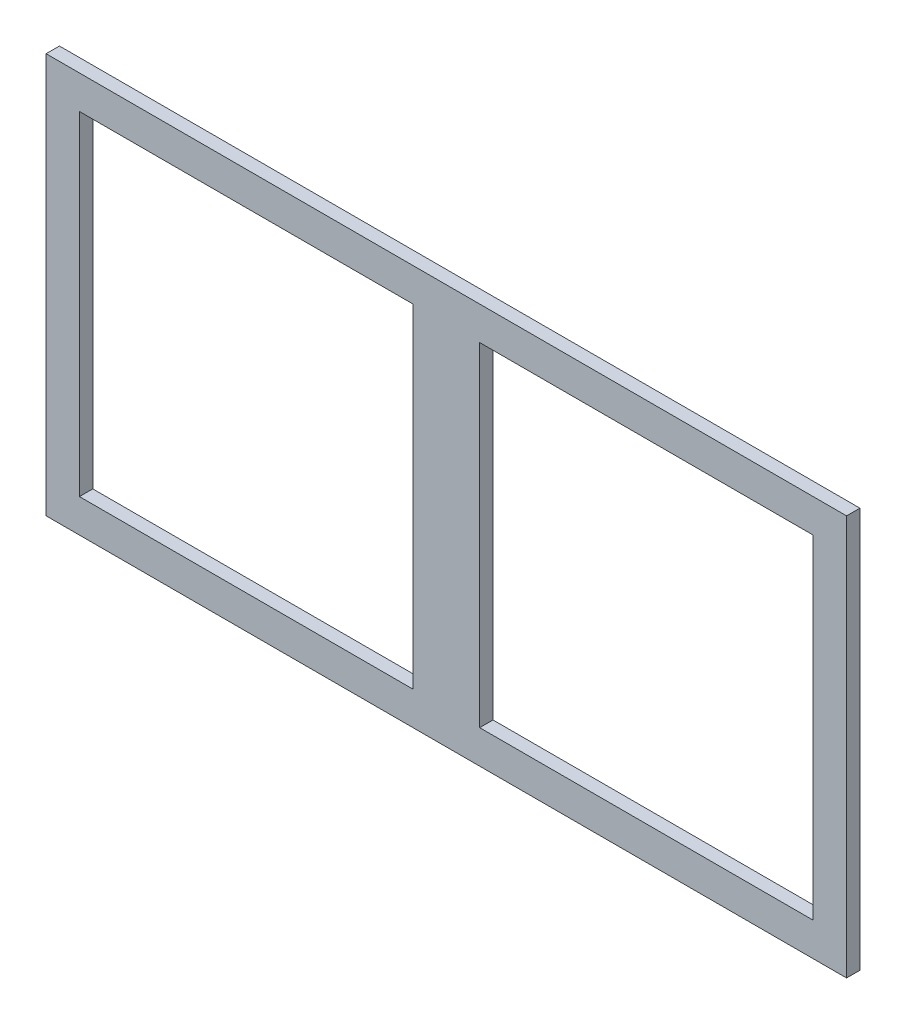
ISO-10303-21;
HEADER;
FILE_DESCRIPTION(('STEP AP214'),'2;1');
FILE_NAME('part.step','',(''),(''),'','','');
FILE_SCHEMA(('AUTOMOTIVE_DESIGN { 1 0 10303 214 1 1 1 1 }'));
ENDSEC;
DATA;
#1=APPLICATION_CONTEXT('core data for automotive mechanical design processes');
#2=APPLICATION_PROTOCOL_DEFINITION('international standard','automotive_design',2000,#1);
#3=PRODUCT_CONTEXT('',#1,'mechanical');
#4=PRODUCT('Part','Part','',(#3));
#5=PRODUCT_RELATED_PRODUCT_CATEGORY('part','',(#4));
#6=PRODUCT_DEFINITION_FORMATION('','',#4);
#7=PRODUCT_DEFINITION_CONTEXT('part definition',#1,'design');
#8=PRODUCT_DEFINITION('design','',#6,#7);
#9=PRODUCT_DEFINITION_SHAPE('','',#8);
#10=(LENGTH_UNIT() NAMED_UNIT(*) SI_UNIT(.MILLI.,.METRE.));
#11=(NAMED_UNIT(*) PLANE_ANGLE_UNIT() SI_UNIT($,.RADIAN.));
#12=(NAMED_UNIT(*) SI_UNIT($,.STERADIAN.) SOLID_ANGLE_UNIT());
#13=UNCERTAINTY_MEASURE_WITH_UNIT(LENGTH_MEASURE(1.E-05),#10,'distance_accuracy_value','');
#14=(GEOMETRIC_REPRESENTATION_CONTEXT(3) GLOBAL_UNCERTAINTY_ASSIGNED_CONTEXT((#13)) GLOBAL_UNIT_ASSIGNED_CONTEXT((#10,
#11,#12)) REPRESENTATION_CONTEXT('',''));
#15=CARTESIAN_POINT('',(0.,0.,0.));
#16=DIRECTION('',(0.,0.,1.));
#17=DIRECTION('',(1.,0.,0.));
#18=AXIS2_PLACEMENT_3D('',#15,#16,#17);
#19=CARTESIAN_POINT('',(-150.,0.,5.));
#20=DIRECTION('',(1.,0.,0.));
#21=DIRECTION('',(0.,0.,-1.));
#22=AXIS2_PLACEMENT_3D('',#19,#20,#21);
#23=PLANE('',#22);
#24=DIRECTION('',(0.,-1.,0.));
#25=VECTOR('',#24,1.);
#26=CARTESIAN_POINT('',(-150.,0.,0.));
#27=LINE('',#26,#25);
#28=CARTESIAN_POINT('',(-150.,150.,0.));
#29=VERTEX_POINT('',#28);
#30=CARTESIAN_POINT('',(-150.,0.,0.));
#31=VERTEX_POINT('',#30);
#32=EDGE_CURVE('E158',#29,#31,#27,.T.);
#33=ORIENTED_EDGE('',*,*,#32,.T.);
#34=DIRECTION('',(0.,0.,-1.));
#35=VECTOR('',#34,1.);
#36=CARTESIAN_POINT('',(-150.,0.,5.));
#37=LINE('',#36,#35);
#38=CARTESIAN_POINT('',(-150.,0.,5.));
#39=VERTEX_POINT('',#38);
#40=EDGE_CURVE('E11',#39,#31,#37,.T.);
#41=ORIENTED_EDGE('',*,*,#40,.F.);
#42=DIRECTION('',(0.,-1.,0.));
#43=VECTOR('',#42,1.);
#44=CARTESIAN_POINT('',(-150.,0.,5.));
#45=LINE('',#44,#43);
#46=CARTESIAN_POINT('',(-150.,150.,5.));
#47=VERTEX_POINT('',#46);
#48=EDGE_CURVE('E191',#47,#39,#45,.T.);
#49=ORIENTED_EDGE('',*,*,#48,.F.);
#50=DIRECTION('',(0.,0.,-1.));
#51=VECTOR('',#50,1.);
#52=CARTESIAN_POINT('',(-150.,150.,5.));
#53=LINE('',#52,#51);
#54=EDGE_CURVE('E201',#47,#29,#53,.T.);
#55=ORIENTED_EDGE('',*,*,#54,.T.);
#56=EDGE_LOOP('',(#33,#41,#49,#55));
#57=FACE_BOUND('',#56,.T.);
#58=ADVANCED_FACE('F33',(#57),#23,.F.);
#59=CARTESIAN_POINT('',(150.,0.,5.));
#60=DIRECTION('',(0.,1.,0.));
#61=DIRECTION('',(0.,0.,1.));
#62=AXIS2_PLACEMENT_3D('',#59,#60,#61);
#63=PLANE('',#62);
#64=DIRECTION('',(1.,0.,0.));
#65=VECTOR('',#64,1.);
#66=CARTESIAN_POINT('',(150.,0.,0.));
#67=LINE('',#66,#65);
#68=CARTESIAN_POINT('',(150.,0.,0.));
#69=VERTEX_POINT('',#68);
#70=EDGE_CURVE('E204',#31,#69,#67,.T.);
#71=ORIENTED_EDGE('',*,*,#70,.T.);
#72=DIRECTION('',(0.,0.,-1.));
#73=VECTOR('',#72,1.);
#74=CARTESIAN_POINT('',(150.,0.,5.));
#75=LINE('',#74,#73);
#76=CARTESIAN_POINT('',(150.,0.,5.));
#77=VERTEX_POINT('',#76);
#78=EDGE_CURVE('E40',#77,#69,#75,.T.);
#79=ORIENTED_EDGE('',*,*,#78,.F.);
#80=DIRECTION('',(1.,0.,0.));
#81=VECTOR('',#80,1.);
#82=CARTESIAN_POINT('',(150.,0.,5.));
#83=LINE('',#82,#81);
#84=EDGE_CURVE('E194',#39,#77,#83,.T.);
#85=ORIENTED_EDGE('',*,*,#84,.F.);
#86=ORIENTED_EDGE('',*,*,#40,.T.);
#87=EDGE_LOOP('',(#71,#79,#85,#86));
#88=FACE_BOUND('',#87,.T.);
#89=ADVANCED_FACE('F233',(#88),#63,.F.);
#90=CARTESIAN_POINT('',(150.,0.,5.));
#91=DIRECTION('',(-1.,0.,0.));
#92=DIRECTION('',(0.,0.,1.));
#93=AXIS2_PLACEMENT_3D('',#90,#91,#92);
#94=PLANE('',#93);
#95=DIRECTION('',(0.,1.,0.));
#96=VECTOR('',#95,1.);
#97=CARTESIAN_POINT('',(150.,0.,0.));
#98=LINE('',#97,#96);
#99=CARTESIAN_POINT('',(150.,150.,0.));
#100=VERTEX_POINT('',#99);
#101=EDGE_CURVE('E206',#69,#100,#98,.T.);
#102=ORIENTED_EDGE('',*,*,#101,.T.);
#103=DIRECTION('',(0.,0.,-1.));
#104=VECTOR('',#103,1.);
#105=CARTESIAN_POINT('',(150.,150.,5.));
#106=LINE('',#105,#104);
#107=CARTESIAN_POINT('',(150.,150.,5.));
#108=VERTEX_POINT('',#107);
#109=EDGE_CURVE('E211',#108,#100,#106,.T.);
#110=ORIENTED_EDGE('',*,*,#109,.F.);
#111=DIRECTION('',(0.,1.,0.));
#112=VECTOR('',#111,1.);
#113=CARTESIAN_POINT('',(150.,0.,5.));
#114=LINE('',#113,#112);
#115=EDGE_CURVE('E197',#77,#108,#114,.T.);
#116=ORIENTED_EDGE('',*,*,#115,.F.);
#117=ORIENTED_EDGE('',*,*,#78,.T.);
#118=EDGE_LOOP('',(#102,#110,#116,#117));
#119=FACE_BOUND('',#118,.T.);
#120=ADVANCED_FACE('F218',(#119),#94,.F.);
#121=CARTESIAN_POINT('',(-150.,150.,5.));
#122=DIRECTION('',(0.,-1.,0.));
#123=DIRECTION('',(0.,0.,-1.));
#124=AXIS2_PLACEMENT_3D('',#121,#122,#123);
#125=PLANE('',#124);
#126=DIRECTION('',(-1.,0.,0.));
#127=VECTOR('',#126,1.);
#128=CARTESIAN_POINT('',(-150.,150.,0.));
#129=LINE('',#128,#127);
#130=EDGE_CURVE('E195',#100,#29,#129,.T.);
#131=ORIENTED_EDGE('',*,*,#130,.T.);
#132=ORIENTED_EDGE('',*,*,#54,.F.);
#133=DIRECTION('',(-1.,0.,0.));
#134=VECTOR('',#133,1.);
#135=CARTESIAN_POINT('',(-150.,150.,5.));
#136=LINE('',#135,#134);
#137=EDGE_CURVE('E199',#108,#47,#136,.T.);
#138=ORIENTED_EDGE('',*,*,#137,.F.);
#139=ORIENTED_EDGE('',*,*,#109,.T.);
#140=EDGE_LOOP('',(#131,#132,#138,#139));
#141=FACE_BOUND('',#140,.T.);
#142=ADVANCED_FACE('F226',(#141),#125,.F.);
#143=CARTESIAN_POINT('',(0.,0.,5.));
#144=DIRECTION('',(0.,0.,-1.));
#145=DIRECTION('',(-1.,0.,0.));
#146=AXIS2_PLACEMENT_3D('',#143,#144,#145);
#147=PLANE('',#146);
#148=DIRECTION('',(1.,0.,0.));
#149=VECTOR('',#148,1.);
#150=CARTESIAN_POINT('',(-137.5,12.5,5.));
#151=LINE('',#150,#149);
#152=CARTESIAN_POINT('',(-137.5,12.5,5.));
#153=VERTEX_POINT('',#152);
#154=CARTESIAN_POINT('',(-12.5,12.5,5.));
#155=VERTEX_POINT('',#154);
#156=EDGE_CURVE('E151',#153,#155,#151,.T.);
#157=ORIENTED_EDGE('',*,*,#156,.F.);
#158=DIRECTION('',(0.,-1.,0.));
#159=VECTOR('',#158,1.);
#160=CARTESIAN_POINT('',(-137.5,137.5,5.));
#161=LINE('',#160,#159);
#162=CARTESIAN_POINT('',(-137.5,137.5,5.));
#163=VERTEX_POINT('',#162);
#164=EDGE_CURVE('E47',#163,#153,#161,.T.);
#165=ORIENTED_EDGE('',*,*,#164,.F.);
#166=DIRECTION('',(-1.,0.,0.));
#167=VECTOR('',#166,1.);
#168=CARTESIAN_POINT('',(-137.5,137.5,5.));
#169=LINE('',#168,#167);
#170=CARTESIAN_POINT('',(-12.5,137.5,5.));
#171=VERTEX_POINT('',#170);
#172=EDGE_CURVE('E142',#171,#163,#169,.T.);
#173=ORIENTED_EDGE('',*,*,#172,.F.);
#174=DIRECTION('',(0.,1.,0.));
#175=VECTOR('',#174,1.);
#176=CARTESIAN_POINT('',(-12.5,137.5,5.));
#177=LINE('',#176,#175);
#178=EDGE_CURVE('E145',#155,#171,#177,.T.);
#179=ORIENTED_EDGE('',*,*,#178,.F.);
#180=EDGE_LOOP('',(#157,#165,#173,#179));
#181=FACE_BOUND('',#180,.T.);
#182=DIRECTION('',(0.,-1.,0.));
#183=VECTOR('',#182,1.);
#184=CARTESIAN_POINT('',(12.5,137.5,5.));
#185=LINE('',#184,#183);
#186=CARTESIAN_POINT('',(12.5,137.5,5.));
#187=VERTEX_POINT('',#186);
#188=CARTESIAN_POINT('',(12.5,12.5,5.));
#189=VERTEX_POINT('',#188);
#190=EDGE_CURVE('E177',#187,#189,#185,.T.);
#191=ORIENTED_EDGE('',*,*,#190,.F.);
#192=DIRECTION('',(-1.,0.,0.));
#193=VECTOR('',#192,1.);
#194=CARTESIAN_POINT('',(137.5,137.5,5.));
#195=LINE('',#194,#193);
#196=CARTESIAN_POINT('',(137.5,137.5,5.));
#197=VERTEX_POINT('',#196);
#198=EDGE_CURVE('E55',#197,#187,#195,.T.);
#199=ORIENTED_EDGE('',*,*,#198,.F.);
#200=DIRECTION('',(0.,1.,0.));
#201=VECTOR('',#200,1.);
#202=CARTESIAN_POINT('',(137.5,137.5,5.));
#203=LINE('',#202,#201);
#204=CARTESIAN_POINT('',(137.5,12.5,5.));
#205=VERTEX_POINT('',#204);
#206=EDGE_CURVE('E166',#205,#197,#203,.T.);
#207=ORIENTED_EDGE('',*,*,#206,.F.);
#208=DIRECTION('',(1.,0.,0.));
#209=VECTOR('',#208,1.);
#210=CARTESIAN_POINT('',(137.5,12.5,5.));
#211=LINE('',#210,#209);
#212=EDGE_CURVE('E180',#189,#205,#211,.T.);
#213=ORIENTED_EDGE('',*,*,#212,.F.);
#214=EDGE_LOOP('',(#191,#199,#207,#213));
#215=FACE_BOUND('',#214,.T.);
#216=ORIENTED_EDGE('',*,*,#48,.T.);
#217=ORIENTED_EDGE('',*,*,#84,.T.);
#218=ORIENTED_EDGE('',*,*,#115,.T.);
#219=ORIENTED_EDGE('',*,*,#137,.T.);
#220=EDGE_LOOP('',(#216,#217,#218,#219));
#221=FACE_BOUND('',#220,.T.);
#222=ADVANCED_FACE('F232',(#181,#215,#221),#147,.F.);
#223=CARTESIAN_POINT('',(0.,0.,0.));
#224=DIRECTION('',(0.,0.,-1.));
#225=DIRECTION('',(-1.,0.,0.));
#226=AXIS2_PLACEMENT_3D('',#223,#224,#225);
#227=PLANE('',#226);
#228=DIRECTION('',(0.,-1.,0.));
#229=VECTOR('',#228,1.);
#230=CARTESIAN_POINT('',(-137.5,137.5,0.));
#231=LINE('',#230,#229);
#232=CARTESIAN_POINT('',(-137.5,137.5,0.));
#233=VERTEX_POINT('',#232);
#234=CARTESIAN_POINT('',(-137.5,12.5,0.));
#235=VERTEX_POINT('',#234);
#236=EDGE_CURVE('E123',#233,#235,#231,.T.);
#237=ORIENTED_EDGE('',*,*,#236,.T.);
#238=DIRECTION('',(1.,0.,0.));
#239=VECTOR('',#238,1.);
#240=CARTESIAN_POINT('',(-137.5,12.5,0.));
#241=LINE('',#240,#239);
#242=CARTESIAN_POINT('',(-12.5,12.5,0.));
#243=VERTEX_POINT('',#242);
#244=EDGE_CURVE('E133',#235,#243,#241,.T.);
#245=ORIENTED_EDGE('',*,*,#244,.T.);
#246=DIRECTION('',(0.,1.,0.));
#247=VECTOR('',#246,1.);
#248=CARTESIAN_POINT('',(-12.5,137.5,0.));
#249=LINE('',#248,#247);
#250=CARTESIAN_POINT('',(-12.5,137.5,0.));
#251=VERTEX_POINT('',#250);
#252=EDGE_CURVE('E137',#243,#251,#249,.T.);
#253=ORIENTED_EDGE('',*,*,#252,.T.);
#254=DIRECTION('',(-1.,0.,0.));
#255=VECTOR('',#254,1.);
#256=CARTESIAN_POINT('',(-137.5,137.5,0.));
#257=LINE('',#256,#255);
#258=EDGE_CURVE('E129',#251,#233,#257,.T.);
#259=ORIENTED_EDGE('',*,*,#258,.T.);
#260=EDGE_LOOP('',(#237,#245,#253,#259));
#261=FACE_BOUND('',#260,.T.);
#262=DIRECTION('',(-1.,0.,0.));
#263=VECTOR('',#262,1.);
#264=CARTESIAN_POINT('',(137.5,137.5,0.));
#265=LINE('',#264,#263);
#266=CARTESIAN_POINT('',(137.5,137.5,0.));
#267=VERTEX_POINT('',#266);
#268=CARTESIAN_POINT('',(12.5,137.5,0.));
#269=VERTEX_POINT('',#268);
#270=EDGE_CURVE('E162',#267,#269,#265,.T.);
#271=ORIENTED_EDGE('',*,*,#270,.T.);
#272=DIRECTION('',(0.,-1.,0.));
#273=VECTOR('',#272,1.);
#274=CARTESIAN_POINT('',(12.5,137.5,0.));
#275=LINE('',#274,#273);
#276=CARTESIAN_POINT('',(12.5,12.5,0.));
#277=VERTEX_POINT('',#276);
#278=EDGE_CURVE('E165',#269,#277,#275,.T.);
#279=ORIENTED_EDGE('',*,*,#278,.T.);
#280=DIRECTION('',(1.,0.,0.));
#281=VECTOR('',#280,1.);
#282=CARTESIAN_POINT('',(137.5,12.5,0.));
#283=LINE('',#282,#281);
#284=CARTESIAN_POINT('',(137.5,12.5,0.));
#285=VERTEX_POINT('',#284);
#286=EDGE_CURVE('E169',#277,#285,#283,.T.);
#287=ORIENTED_EDGE('',*,*,#286,.T.);
#288=DIRECTION('',(0.,1.,0.));
#289=VECTOR('',#288,1.);
#290=CARTESIAN_POINT('',(137.5,137.5,0.));
#291=LINE('',#290,#289);
#292=EDGE_CURVE('E172',#285,#267,#291,.T.);
#293=ORIENTED_EDGE('',*,*,#292,.T.);
#294=EDGE_LOOP('',(#271,#279,#287,#293));
#295=FACE_BOUND('',#294,.T.);
#296=ORIENTED_EDGE('',*,*,#32,.F.);
#297=ORIENTED_EDGE('',*,*,#130,.F.);
#298=ORIENTED_EDGE('',*,*,#101,.F.);
#299=ORIENTED_EDGE('',*,*,#70,.F.);
#300=EDGE_LOOP('',(#296,#297,#298,#299));
#301=FACE_BOUND('',#300,.T.);
#302=ADVANCED_FACE('F139',(#261,#295,#301),#227,.T.);
#303=CARTESIAN_POINT('',(137.5,137.5,0.));
#304=DIRECTION('',(0.,1.,0.));
#305=DIRECTION('',(0.,0.,1.));
#306=AXIS2_PLACEMENT_3D('',#303,#304,#305);
#307=PLANE('',#306);
#308=ORIENTED_EDGE('',*,*,#198,.T.);
#309=DIRECTION('',(0.,0.,1.));
#310=VECTOR('',#309,1.);
#311=CARTESIAN_POINT('',(12.5,137.5,0.));
#312=LINE('',#311,#310);
#313=EDGE_CURVE('E175',#269,#187,#312,.T.);
#314=ORIENTED_EDGE('',*,*,#313,.F.);
#315=ORIENTED_EDGE('',*,*,#270,.F.);
#316=DIRECTION('',(0.,0.,1.));
#317=VECTOR('',#316,1.);
#318=CARTESIAN_POINT('',(137.5,137.5,0.));
#319=LINE('',#318,#317);
#320=EDGE_CURVE('E152',#267,#197,#319,.T.);
#321=ORIENTED_EDGE('',*,*,#320,.T.);
#322=EDGE_LOOP('',(#308,#314,#315,#321));
#323=FACE_BOUND('',#322,.T.);
#324=ADVANCED_FACE('F245',(#323),#307,.F.);
#325=CARTESIAN_POINT('',(137.5,137.5,0.));
#326=DIRECTION('',(1.,0.,0.));
#327=DIRECTION('',(0.,1.,0.));
#328=AXIS2_PLACEMENT_3D('',#325,#326,#327);
#329=PLANE('',#328);
#330=ORIENTED_EDGE('',*,*,#206,.T.);
#331=ORIENTED_EDGE('',*,*,#320,.F.);
#332=ORIENTED_EDGE('',*,*,#292,.F.);
#333=DIRECTION('',(0.,0.,1.));
#334=VECTOR('',#333,1.);
#335=CARTESIAN_POINT('',(137.5,12.5,0.));
#336=LINE('',#335,#334);
#337=EDGE_CURVE('E186',#285,#205,#336,.T.);
#338=ORIENTED_EDGE('',*,*,#337,.T.);
#339=EDGE_LOOP('',(#330,#331,#332,#338));
#340=FACE_BOUND('',#339,.T.);
#341=ADVANCED_FACE('F251',(#340),#329,.F.);
#342=CARTESIAN_POINT('',(137.5,12.5,0.));
#343=DIRECTION('',(0.,-1.,0.));
#344=DIRECTION('',(0.,0.,-1.));
#345=AXIS2_PLACEMENT_3D('',#342,#343,#344);
#346=PLANE('',#345);
#347=ORIENTED_EDGE('',*,*,#212,.T.);
#348=ORIENTED_EDGE('',*,*,#337,.F.);
#349=ORIENTED_EDGE('',*,*,#286,.F.);
#350=DIRECTION('',(0.,0.,1.));
#351=VECTOR('',#350,1.);
#352=CARTESIAN_POINT('',(12.5,12.5,0.));
#353=LINE('',#352,#351);
#354=EDGE_CURVE('E188',#277,#189,#353,.T.);
#355=ORIENTED_EDGE('',*,*,#354,.T.);
#356=EDGE_LOOP('',(#347,#348,#349,#355));
#357=FACE_BOUND('',#356,.T.);
#358=ADVANCED_FACE('F255',(#357),#346,.F.);
#359=CARTESIAN_POINT('',(12.5,137.5,0.));
#360=DIRECTION('',(-1.,0.,0.));
#361=DIRECTION('',(0.,-1.,0.));
#362=AXIS2_PLACEMENT_3D('',#359,#360,#361);
#363=PLANE('',#362);
#364=ORIENTED_EDGE('',*,*,#190,.T.);
#365=ORIENTED_EDGE('',*,*,#354,.F.);
#366=ORIENTED_EDGE('',*,*,#278,.F.);
#367=ORIENTED_EDGE('',*,*,#313,.T.);
#368=EDGE_LOOP('',(#364,#365,#366,#367));
#369=FACE_BOUND('',#368,.T.);
#370=ADVANCED_FACE('F252',(#369),#363,.F.);
#371=CARTESIAN_POINT('',(-137.5,137.5,0.));
#372=DIRECTION('',(-1.,0.,0.));
#373=DIRECTION('',(0.,-1.,0.));
#374=AXIS2_PLACEMENT_3D('',#371,#372,#373);
#375=PLANE('',#374);
#376=ORIENTED_EDGE('',*,*,#164,.T.);
#377=DIRECTION('',(0.,0.,1.));
#378=VECTOR('',#377,1.);
#379=CARTESIAN_POINT('',(-137.5,12.5,0.));
#380=LINE('',#379,#378);
#381=EDGE_CURVE('E119',#235,#153,#380,.T.);
#382=ORIENTED_EDGE('',*,*,#381,.F.);
#383=ORIENTED_EDGE('',*,*,#236,.F.);
#384=DIRECTION('',(0.,0.,1.));
#385=VECTOR('',#384,1.);
#386=CARTESIAN_POINT('',(-137.5,137.5,0.));
#387=LINE('',#386,#385);
#388=EDGE_CURVE('E156',#233,#163,#387,.T.);
#389=ORIENTED_EDGE('',*,*,#388,.T.);
#390=EDGE_LOOP('',(#376,#382,#383,#389));
#391=FACE_BOUND('',#390,.T.);
#392=ADVANCED_FACE('F121',(#391),#375,.F.);
#393=CARTESIAN_POINT('',(-137.5,137.5,0.));
#394=DIRECTION('',(0.,1.,0.));
#395=DIRECTION('',(0.,0.,1.));
#396=AXIS2_PLACEMENT_3D('',#393,#394,#395);
#397=PLANE('',#396);
#398=ORIENTED_EDGE('',*,*,#172,.T.);
#399=ORIENTED_EDGE('',*,*,#388,.F.);
#400=ORIENTED_EDGE('',*,*,#258,.F.);
#401=DIRECTION('',(0.,0.,1.));
#402=VECTOR('',#401,1.);
#403=CARTESIAN_POINT('',(-12.5,137.5,0.));
#404=LINE('',#403,#402);
#405=EDGE_CURVE('E159',#251,#171,#404,.T.);
#406=ORIENTED_EDGE('',*,*,#405,.T.);
#407=EDGE_LOOP('',(#398,#399,#400,#406));
#408=FACE_BOUND('',#407,.T.);
#409=ADVANCED_FACE('F265',(#408),#397,.F.);
#410=CARTESIAN_POINT('',(-12.5,137.5,0.));
#411=DIRECTION('',(1.,0.,0.));
#412=DIRECTION('',(0.,1.,0.));
#413=AXIS2_PLACEMENT_3D('',#410,#411,#412);
#414=PLANE('',#413);
#415=ORIENTED_EDGE('',*,*,#178,.T.);
#416=ORIENTED_EDGE('',*,*,#405,.F.);
#417=ORIENTED_EDGE('',*,*,#252,.F.);
#418=DIRECTION('',(0.,0.,1.));
#419=VECTOR('',#418,1.);
#420=CARTESIAN_POINT('',(-12.5,12.5,0.));
#421=LINE('',#420,#419);
#422=EDGE_CURVE('E128',#243,#155,#421,.T.);
#423=ORIENTED_EDGE('',*,*,#422,.T.);
#424=EDGE_LOOP('',(#415,#416,#417,#423));
#425=FACE_BOUND('',#424,.T.);
#426=ADVANCED_FACE('F268',(#425),#414,.F.);
#427=CARTESIAN_POINT('',(-137.5,12.5,0.));
#428=DIRECTION('',(0.,-1.,0.));
#429=DIRECTION('',(0.,0.,-1.));
#430=AXIS2_PLACEMENT_3D('',#427,#428,#429);
#431=PLANE('',#430);
#432=ORIENTED_EDGE('',*,*,#156,.T.);
#433=ORIENTED_EDGE('',*,*,#422,.F.);
#434=ORIENTED_EDGE('',*,*,#244,.F.);
#435=ORIENTED_EDGE('',*,*,#381,.T.);
#436=EDGE_LOOP('',(#432,#433,#434,#435));
#437=FACE_BOUND('',#436,.T.);
#438=ADVANCED_FACE('F134',(#437),#431,.F.);
#439=CLOSED_SHELL('',(#58,#89,#120,#142,#222,#302,#324,#341,#358,#370,#392,#409,#426,#438));
#440=MANIFOLD_SOLID_BREP('B2',#439);
#441=ADVANCED_BREP_SHAPE_REPRESENTATION('',(#18,#440),#14);
#442=SHAPE_DEFINITION_REPRESENTATION(#9,#441);
ENDSEC;
END-ISO-10303-21;
